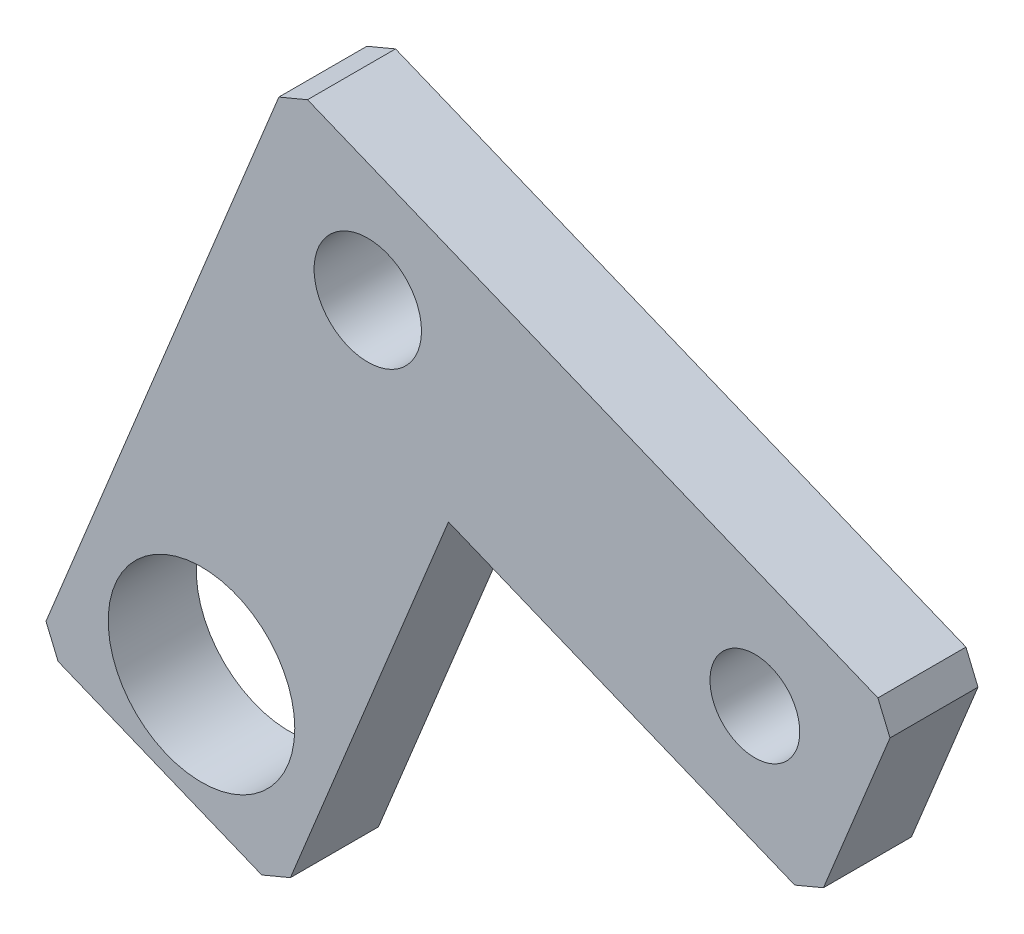
ISO-10303-21;
HEADER;
FILE_DESCRIPTION(('STEP AP214'),'2;1');
FILE_NAME('part.step','',(''),(''),'','','');
FILE_SCHEMA(('AUTOMOTIVE_DESIGN { 1 0 10303 214 1 1 1 1 }'));
ENDSEC;
DATA;
#1=APPLICATION_CONTEXT('core data for automotive mechanical design processes');
#2=APPLICATION_PROTOCOL_DEFINITION('international standard','automotive_design',2000,#1);
#3=PRODUCT_CONTEXT('',#1,'mechanical');
#4=PRODUCT('Part','Part','',(#3));
#5=PRODUCT_RELATED_PRODUCT_CATEGORY('part','',(#4));
#6=PRODUCT_DEFINITION_FORMATION('','',#4);
#7=PRODUCT_DEFINITION_CONTEXT('part definition',#1,'design');
#8=PRODUCT_DEFINITION('design','',#6,#7);
#9=PRODUCT_DEFINITION_SHAPE('','',#8);
#10=(LENGTH_UNIT() NAMED_UNIT(*) SI_UNIT(.MILLI.,.METRE.));
#11=(NAMED_UNIT(*) PLANE_ANGLE_UNIT() SI_UNIT($,.RADIAN.));
#12=(NAMED_UNIT(*) SI_UNIT($,.STERADIAN.) SOLID_ANGLE_UNIT());
#13=UNCERTAINTY_MEASURE_WITH_UNIT(LENGTH_MEASURE(1.E-05),#10,'distance_accuracy_value','');
#14=(GEOMETRIC_REPRESENTATION_CONTEXT(3) GLOBAL_UNCERTAINTY_ASSIGNED_CONTEXT((#13)) GLOBAL_UNIT_ASSIGNED_CONTEXT((#10,
#11,#12)) REPRESENTATION_CONTEXT('',''));
#15=CARTESIAN_POINT('',(0.,0.,0.));
#16=DIRECTION('',(0.,0.,1.));
#17=DIRECTION('',(1.,0.,0.));
#18=AXIS2_PLACEMENT_3D('',#15,#16,#17);
#19=CARTESIAN_POINT('',(-71.0286932422656,-54.4869970943026,-10.));
#20=DIRECTION('',(-0.925838313972113,0.377919854441752,0.));
#21=DIRECTION('',(-0.377919854441752,-0.925838313972113,0.));
#22=AXIS2_PLACEMENT_3D('',#19,#20,#21);
#23=PLANE('',#22);
#24=DIRECTION('',(-0.377919854441752,-0.925838313972113,0.));
#25=VECTOR('',#24,1.);
#26=CARTESIAN_POINT('',(-71.0286932422656,-54.4869970943026,-10.));
#27=LINE('',#26,#25);
#28=CARTESIAN_POINT('',(-43.6295037952386,12.6362806686756,-10.));
#29=VERTEX_POINT('',#28);
#30=CARTESIAN_POINT('',(-70.0838936061613,-52.1724013093723,-10.));
#31=VERTEX_POINT('',#30);
#32=EDGE_CURVE('E162',#29,#31,#27,.T.);
#33=ORIENTED_EDGE('',*,*,#32,.T.);
#34=DIRECTION('',(0.,0.,1.));
#35=VECTOR('',#34,1.);
#36=CARTESIAN_POINT('',(-70.0838936061613,-52.1724013093723,-10.));
#37=LINE('',#36,#35);
#38=CARTESIAN_POINT('',(-70.0838936061613,-52.1724013093723,0.));
#39=VERTEX_POINT('',#38);
#40=EDGE_CURVE('E11',#31,#39,#37,.T.);
#41=ORIENTED_EDGE('',*,*,#40,.T.);
#42=DIRECTION('',(-0.377919854441752,-0.925838313972113,0.));
#43=VECTOR('',#42,1.);
#44=CARTESIAN_POINT('',(-71.0286932422656,-54.4869970943026,0.));
#45=LINE('',#44,#43);
#46=CARTESIAN_POINT('',(-43.6295037952386,12.6362806686756,0.));
#47=VERTEX_POINT('',#46);
#48=EDGE_CURVE('E147',#47,#39,#45,.T.);
#49=ORIENTED_EDGE('',*,*,#48,.F.);
#50=DIRECTION('',(0.,0.,-1.));
#51=VECTOR('',#50,1.);
#52=CARTESIAN_POINT('',(-43.6295037952386,12.6362806686756,-10.));
#53=LINE('',#52,#51);
#54=EDGE_CURVE('E41',#47,#29,#53,.T.);
#55=ORIENTED_EDGE('',*,*,#54,.T.);
#56=EDGE_LOOP('',(#33,#41,#49,#55));
#57=FACE_BOUND('',#56,.T.);
#58=ADVANCED_FACE('F33',(#57),#23,.T.);
#59=CARTESIAN_POINT('',(-42.6847041591342,14.9508764536059,-10.));
#60=DIRECTION('',(0.377919854441753,0.925838313972113,0.));
#61=DIRECTION('',(-0.925838313972113,0.377919854441753,0.));
#62=AXIS2_PLACEMENT_3D('',#59,#60,#61);
#63=PLANE('',#62);
#64=DIRECTION('',(-0.925838313972113,0.377919854441753,0.));
#65=VECTOR('',#64,1.);
#66=CARTESIAN_POINT('',(-42.6847041591342,14.9508764536059,0.));
#67=LINE('',#66,#65);
#68=CARTESIAN_POINT('',(24.438573603844,-12.4483129934212,0.));
#69=VERTEX_POINT('',#68);
#70=CARTESIAN_POINT('',(-40.3701083742039,14.0060768175015,0.));
#71=VERTEX_POINT('',#70);
#72=EDGE_CURVE('E160',#69,#71,#67,.T.);
#73=ORIENTED_EDGE('',*,*,#72,.F.);
#74=DIRECTION('',(0.,0.,-1.));
#75=VECTOR('',#74,1.);
#76=CARTESIAN_POINT('',(24.438573603844,-12.4483129934212,-10.));
#77=LINE('',#76,#75);
#78=CARTESIAN_POINT('',(24.438573603844,-12.4483129934212,-10.));
#79=VERTEX_POINT('',#78);
#80=EDGE_CURVE('E197',#69,#79,#77,.T.);
#81=ORIENTED_EDGE('',*,*,#80,.T.);
#82=DIRECTION('',(-0.925838313972113,0.377919854441753,0.));
#83=VECTOR('',#82,1.);
#84=CARTESIAN_POINT('',(-42.6847041591342,14.9508764536059,-10.));
#85=LINE('',#84,#83);
#86=CARTESIAN_POINT('',(-40.3701083742039,14.0060768175015,-10.));
#87=VERTEX_POINT('',#86);
#88=EDGE_CURVE('E137',#79,#87,#85,.T.);
#89=ORIENTED_EDGE('',*,*,#88,.T.);
#90=DIRECTION('',(0.,0.,1.));
#91=VECTOR('',#90,1.);
#92=CARTESIAN_POINT('',(-40.3701083742039,14.0060768175015,-10.));
#93=LINE('',#92,#91);
#94=EDGE_CURVE('E194',#87,#71,#93,.T.);
#95=ORIENTED_EDGE('',*,*,#94,.T.);
#96=EDGE_LOOP('',(#73,#81,#89,#95));
#97=FACE_BOUND('',#96,.T.);
#98=ADVANCED_FACE('F212',(#97),#63,.T.);
#99=CARTESIAN_POINT('',(26.7531693887742,-13.3931126295256,-10.));
#100=DIRECTION('',(0.925838313972113,-0.377919854441753,0.));
#101=DIRECTION('',(0.377919854441753,0.925838313972113,0.));
#102=AXIS2_PLACEMENT_3D('',#99,#100,#101);
#103=PLANE('',#102);
#104=DIRECTION('',(0.377919854441753,0.925838313972113,0.));
#105=VECTOR('',#104,1.);
#106=CARTESIAN_POINT('',(26.7531693887742,-13.3931126295256,0.));
#107=LINE('',#106,#105);
#108=CARTESIAN_POINT('',(18.2499726638348,-34.2244746938981,0.));
#109=VERTEX_POINT('',#108);
#110=CARTESIAN_POINT('',(25.8083697526699,-15.7077084144558,0.));
#111=VERTEX_POINT('',#110);
#112=EDGE_CURVE('E157',#109,#111,#107,.T.);
#113=ORIENTED_EDGE('',*,*,#112,.F.);
#114=DIRECTION('',(0.,0.,-1.));
#115=VECTOR('',#114,1.);
#116=CARTESIAN_POINT('',(18.2499726638348,-34.2244746938981,-10.));
#117=LINE('',#116,#115);
#118=CARTESIAN_POINT('',(18.2499726638348,-34.2244746938981,-10.));
#119=VERTEX_POINT('',#118);
#120=EDGE_CURVE('E192',#109,#119,#117,.T.);
#121=ORIENTED_EDGE('',*,*,#120,.T.);
#122=DIRECTION('',(0.377919854441753,0.925838313972113,0.));
#123=VECTOR('',#122,1.);
#124=CARTESIAN_POINT('',(26.7531693887742,-13.3931126295256,-10.));
#125=LINE('',#124,#123);
#126=CARTESIAN_POINT('',(25.8083697526699,-15.7077084144558,-10.));
#127=VERTEX_POINT('',#126);
#128=EDGE_CURVE('E140',#119,#127,#125,.T.);
#129=ORIENTED_EDGE('',*,*,#128,.T.);
#130=DIRECTION('',(0.,0.,1.));
#131=VECTOR('',#130,1.);
#132=CARTESIAN_POINT('',(25.8083697526699,-15.7077084144558,-10.));
#133=LINE('',#132,#131);
#134=EDGE_CURVE('E189',#127,#111,#133,.T.);
#135=ORIENTED_EDGE('',*,*,#134,.T.);
#136=EDGE_LOOP('',(#113,#121,#129,#135));
#137=FACE_BOUND('',#136,.T.);
#138=ADVANCED_FACE('F221',(#137),#103,.T.);
#139=CARTESIAN_POINT('',(17.3051730277304,-36.5390704788284,-10.));
#140=DIRECTION('',(-0.377919854441752,-0.925838313972113,0.));
#141=DIRECTION('',(0.925838313972113,-0.377919854441753,0.));
#142=AXIS2_PLACEMENT_3D('',#139,#140,#141);
#143=PLANE('',#142);
#144=DIRECTION('',(0.925838313972113,-0.377919854441752,0.));
#145=VECTOR('',#144,1.);
#146=CARTESIAN_POINT('',(17.3051730277304,-36.5390704788284,-10.));
#147=LINE('',#146,#145);
#148=CARTESIAN_POINT('',(-24.3575511010146,-19.5326770289495,-10.));
#149=VERTEX_POINT('',#148);
#150=CARTESIAN_POINT('',(14.9905772428001,-35.594270842724,-10.));
#151=VERTEX_POINT('',#150);
#152=EDGE_CURVE('E127',#149,#151,#147,.T.);
#153=ORIENTED_EDGE('',*,*,#152,.T.);
#154=DIRECTION('',(0.,0.,1.));
#155=VECTOR('',#154,1.);
#156=CARTESIAN_POINT('',(14.9905772428001,-35.594270842724,-10.));
#157=LINE('',#156,#155);
#158=CARTESIAN_POINT('',(14.9905772428001,-35.594270842724,0.));
#159=VERTEX_POINT('',#158);
#160=EDGE_CURVE('E187',#151,#159,#157,.T.);
#161=ORIENTED_EDGE('',*,*,#160,.T.);
#162=DIRECTION('',(0.925838313972113,-0.377919854441752,0.));
#163=VECTOR('',#162,1.);
#164=CARTESIAN_POINT('',(17.3051730277304,-36.5390704788284,0.));
#165=LINE('',#164,#163);
#166=CARTESIAN_POINT('',(-24.3575511010146,-19.5326770289495,0.));
#167=VERTEX_POINT('',#166);
#168=EDGE_CURVE('E135',#167,#159,#165,.T.);
#169=ORIENTED_EDGE('',*,*,#168,.F.);
#170=DIRECTION('',(0.,0.,1.));
#171=VECTOR('',#170,1.);
#172=CARTESIAN_POINT('',(-24.3575511010146,-19.5326770289495,-10.));
#173=LINE('',#172,#171);
#174=EDGE_CURVE('E122',#149,#167,#173,.T.);
#175=ORIENTED_EDGE('',*,*,#174,.F.);
#176=EDGE_LOOP('',(#153,#161,#169,#175));
#177=FACE_BOUND('',#176,.T.);
#178=ADVANCED_FACE('F131',(#177),#143,.T.);
#179=CARTESIAN_POINT('',(-24.3575511010146,-19.5326770289495,-10.));
#180=DIRECTION('',(0.925838313972113,-0.377919854441753,0.));
#181=DIRECTION('',(0.377919854441753,0.925838313972113,0.));
#182=AXIS2_PLACEMENT_3D('',#179,#180,#181);
#183=PLANE('',#182);
#184=DIRECTION('',(0.377919854441753,0.925838313972113,0.));
#185=VECTOR('',#184,1.);
#186=CARTESIAN_POINT('',(-24.3575511010146,-19.5326770289495,0.));
#187=LINE('',#186,#185);
#188=CARTESIAN_POINT('',(-42.3087441869979,-63.5099969426249,0.));
#189=VERTEX_POINT('',#188);
#190=EDGE_CURVE('E154',#189,#167,#187,.T.);
#191=ORIENTED_EDGE('',*,*,#190,.F.);
#192=DIRECTION('',(0.,0.,-1.));
#193=VECTOR('',#192,1.);
#194=CARTESIAN_POINT('',(-42.3087441869979,-63.5099969426249,-10.));
#195=LINE('',#194,#193);
#196=CARTESIAN_POINT('',(-42.3087441869979,-63.5099969426249,-10.));
#197=VERTEX_POINT('',#196);
#198=EDGE_CURVE('E125',#189,#197,#195,.T.);
#199=ORIENTED_EDGE('',*,*,#198,.T.);
#200=DIRECTION('',(0.377919854441753,0.925838313972113,0.));
#201=VECTOR('',#200,1.);
#202=CARTESIAN_POINT('',(-24.3575511010146,-19.5326770289495,-10.));
#203=LINE('',#202,#201);
#204=EDGE_CURVE('E118',#197,#149,#203,.T.);
#205=ORIENTED_EDGE('',*,*,#204,.T.);
#206=ORIENTED_EDGE('',*,*,#174,.T.);
#207=EDGE_LOOP('',(#191,#199,#205,#206));
#208=FACE_BOUND('',#207,.T.);
#209=ADVANCED_FACE('F121',(#208),#183,.T.);
#210=CARTESIAN_POINT('',(-43.2535438231023,-65.8245927275552,-10.));
#211=DIRECTION('',(-0.377919854441753,-0.925838313972113,0.));
#212=DIRECTION('',(0.925838313972113,-0.377919854441753,0.));
#213=AXIS2_PLACEMENT_3D('',#210,#211,#212);
#214=PLANE('',#213);
#215=DIRECTION('',(0.925838313972113,-0.377919854441753,0.));
#216=VECTOR('',#215,1.);
#217=CARTESIAN_POINT('',(-43.2535438231023,-65.8245927275552,-10.));
#218=LINE('',#217,#216);
#219=CARTESIAN_POINT('',(-68.7140974573353,-55.431796730407,-10.));
#220=VERTEX_POINT('',#219);
#221=CARTESIAN_POINT('',(-45.5681396080326,-64.8797930914508,-10.));
#222=VERTEX_POINT('',#221);
#223=EDGE_CURVE('E128',#220,#222,#218,.T.);
#224=ORIENTED_EDGE('',*,*,#223,.T.);
#225=DIRECTION('',(0.,0.,1.));
#226=VECTOR('',#225,1.);
#227=CARTESIAN_POINT('',(-45.5681396080326,-64.8797930914508,-10.));
#228=LINE('',#227,#226);
#229=CARTESIAN_POINT('',(-45.5681396080326,-64.8797930914508,0.));
#230=VERTEX_POINT('',#229);
#231=EDGE_CURVE('E165',#222,#230,#228,.T.);
#232=ORIENTED_EDGE('',*,*,#231,.T.);
#233=DIRECTION('',(0.925838313972113,-0.377919854441753,0.));
#234=VECTOR('',#233,1.);
#235=CARTESIAN_POINT('',(-43.2535438231023,-65.8245927275552,0.));
#236=LINE('',#235,#234);
#237=CARTESIAN_POINT('',(-68.7140974573353,-55.431796730407,0.));
#238=VERTEX_POINT('',#237);
#239=EDGE_CURVE('E150',#238,#230,#236,.T.);
#240=ORIENTED_EDGE('',*,*,#239,.F.);
#241=DIRECTION('',(0.,0.,-1.));
#242=VECTOR('',#241,1.);
#243=CARTESIAN_POINT('',(-68.7140974573353,-55.431796730407,-10.));
#244=LINE('',#243,#242);
#245=EDGE_CURVE('E136',#238,#220,#244,.T.);
#246=ORIENTED_EDGE('',*,*,#245,.T.);
#247=EDGE_LOOP('',(#224,#232,#240,#246));
#248=FACE_BOUND('',#247,.T.);
#249=ADVANCED_FACE('F230',(#248),#214,.T.);
#250=CARTESIAN_POINT('',(0.,0.,-10.));
#251=DIRECTION('',(0.,0.,-1.));
#252=DIRECTION('',(-1.,0.,0.));
#253=AXIS2_PLACEMENT_3D('',#250,#251,#252);
#254=PLANE('',#253);
#255=CARTESIAN_POINT('',(-52.417120352162,-48.5828159862775,-10.));
#256=DIRECTION('',(0.,0.,1.));
#257=DIRECTION('',(1.,0.,0.));
#258=AXIS2_PLACEMENT_3D('',#255,#256,#257);
#259=CIRCLE('',#258,10.6);
#260=CARTESIAN_POINT('',(-41.817120352162,-48.5828159862775,-10.));
#261=VERTEX_POINT('',#260);
#262=EDGE_CURVE('E243',#261,#261,#259,.T.);
#263=ORIENTED_EDGE('',*,*,#262,.T.);
#264=EDGE_LOOP('',(#263));
#265=FACE_BOUND('',#264,.T.);
#266=CARTESIAN_POINT('',(-33.5211276300744,-2.29090028767186,-10.));
#267=DIRECTION('',(0.,0.,1.));
#268=DIRECTION('',(1.,0.,0.));
#269=AXIS2_PLACEMENT_3D('',#266,#267,#268);
#270=CIRCLE('',#269,6.1);
#271=CARTESIAN_POINT('',(-27.4211276300744,-2.29090028767186,-10.));
#272=VERTEX_POINT('',#271);
#273=EDGE_CURVE('E237',#272,#272,#270,.T.);
#274=ORIENTED_EDGE('',*,*,#273,.T.);
#275=EDGE_LOOP('',(#274));
#276=FACE_BOUND('',#275,.T.);
#277=CARTESIAN_POINT('',(10.4561922836009,-20.2420933736551,-10.));
#278=DIRECTION('',(0.,0.,1.));
#279=DIRECTION('',(1.,0.,0.));
#280=AXIS2_PLACEMENT_3D('',#277,#278,#279);
#281=CIRCLE('',#280,5.1);
#282=CARTESIAN_POINT('',(15.5561922836009,-20.2420933736551,-10.));
#283=VERTEX_POINT('',#282);
#284=EDGE_CURVE('E151',#283,#283,#281,.T.);
#285=ORIENTED_EDGE('',*,*,#284,.T.);
#286=EDGE_LOOP('',(#285));
#287=FACE_BOUND('',#286,.T.);
#288=ORIENTED_EDGE('',*,*,#204,.F.);
#289=DIRECTION('',(0.921896241912798,0.387436858271203,0.));
#290=VECTOR('',#289,1.);
#291=CARTESIAN_POINT('',(16.3334315672133,-38.8649888566191,-10.));
#292=LINE('',#291,#290);
#293=EDGE_CURVE('E185',#197,#222,#292,.F.);
#294=ORIENTED_EDGE('',*,*,#293,.T.);
#295=ORIENTED_EDGE('',*,*,#223,.F.);
#296=DIRECTION('',(0.387436858271208,-0.921896241912796,0.));
#297=VECTOR('',#296,1.);
#298=CARTESIAN_POINT('',(-78.1985482804191,-32.8637849789617,-10.));
#299=LINE('',#298,#297);
#300=EDGE_CURVE('E181',#220,#31,#299,.F.);
#301=ORIENTED_EDGE('',*,*,#300,.T.);
#302=ORIENTED_EDGE('',*,*,#32,.F.);
#303=DIRECTION('',(-0.921896241912797,-0.387436858271204,0.));
#304=VECTOR('',#303,1.);
#305=CARTESIAN_POINT('',(-11.0624914093047,26.3229195640744,-10.));
#306=LINE('',#305,#304);
#307=EDGE_CURVE('E179',#29,#87,#306,.F.);
#308=ORIENTED_EDGE('',*,*,#307,.T.);
#309=ORIENTED_EDGE('',*,*,#88,.F.);
#310=DIRECTION('',(-0.387436858271207,0.921896241912796,0.));
#311=VECTOR('',#310,1.);
#312=CARTESIAN_POINT('',(16.323918929586,6.86030333698977,-10.));
#313=LINE('',#312,#311);
#314=EDGE_CURVE('E54',#79,#127,#313,.F.);
#315=ORIENTED_EDGE('',*,*,#314,.T.);
#316=ORIENTED_EDGE('',*,*,#128,.F.);
#317=DIRECTION('',(0.921896241912796,0.387436858271207,0.));
#318=VECTOR('',#317,1.);
#319=CARTESIAN_POINT('',(14.9636354183875,-35.6055934355842,-10.));
#320=LINE('',#319,#318);
#321=EDGE_CURVE('E48',#119,#151,#320,.F.);
#322=ORIENTED_EDGE('',*,*,#321,.T.);
#323=ORIENTED_EDGE('',*,*,#152,.F.);
#324=EDGE_LOOP('',(#288,#294,#295,#301,#302,#308,#309,#315,#316,#322,#323));
#325=FACE_BOUND('',#324,.T.);
#326=ADVANCED_FACE('F139',(#265,#276,#287,#325),#254,.T.);
#327=CARTESIAN_POINT('',(0.,0.,0.));
#328=DIRECTION('',(0.,0.,-1.));
#329=DIRECTION('',(-1.,0.,0.));
#330=AXIS2_PLACEMENT_3D('',#327,#328,#329);
#331=PLANE('',#330);
#332=CARTESIAN_POINT('',(-52.417120352162,-48.5828159862775,0.));
#333=DIRECTION('',(0.,0.,1.));
#334=DIRECTION('',(1.,0.,0.));
#335=AXIS2_PLACEMENT_3D('',#332,#333,#334);
#336=CIRCLE('',#335,10.6);
#337=CARTESIAN_POINT('',(-41.817120352162,-48.5828159862775,0.));
#338=VERTEX_POINT('',#337);
#339=EDGE_CURVE('E246',#338,#338,#336,.T.);
#340=ORIENTED_EDGE('',*,*,#339,.F.);
#341=EDGE_LOOP('',(#340));
#342=FACE_BOUND('',#341,.T.);
#343=CARTESIAN_POINT('',(-33.5211276300744,-2.29090028767186,0.));
#344=DIRECTION('',(0.,0.,1.));
#345=DIRECTION('',(1.,0.,0.));
#346=AXIS2_PLACEMENT_3D('',#343,#344,#345);
#347=CIRCLE('',#346,6.1);
#348=CARTESIAN_POINT('',(-27.4211276300744,-2.29090028767186,0.));
#349=VERTEX_POINT('',#348);
#350=EDGE_CURVE('E240',#349,#349,#347,.T.);
#351=ORIENTED_EDGE('',*,*,#350,.F.);
#352=EDGE_LOOP('',(#351));
#353=FACE_BOUND('',#352,.T.);
#354=CARTESIAN_POINT('',(10.4561922836009,-20.2420933736551,0.));
#355=DIRECTION('',(0.,0.,1.));
#356=DIRECTION('',(1.,0.,0.));
#357=AXIS2_PLACEMENT_3D('',#354,#355,#356);
#358=CIRCLE('',#357,5.1);
#359=CARTESIAN_POINT('',(15.5561922836009,-20.2420933736551,0.));
#360=VERTEX_POINT('',#359);
#361=EDGE_CURVE('E234',#360,#360,#358,.T.);
#362=ORIENTED_EDGE('',*,*,#361,.F.);
#363=EDGE_LOOP('',(#362));
#364=FACE_BOUND('',#363,.T.);
#365=ORIENTED_EDGE('',*,*,#239,.T.);
#366=DIRECTION('',(-0.921896241912798,-0.387436858271203,0.));
#367=VECTOR('',#366,1.);
#368=CARTESIAN_POINT('',(-45.5681396080326,-64.8797930914508,0.));
#369=LINE('',#368,#367);
#370=EDGE_CURVE('E176',#230,#189,#369,.F.);
#371=ORIENTED_EDGE('',*,*,#370,.T.);
#372=ORIENTED_EDGE('',*,*,#190,.T.);
#373=ORIENTED_EDGE('',*,*,#168,.T.);
#374=DIRECTION('',(-0.921896241912796,-0.387436858271207,0.));
#375=VECTOR('',#374,1.);
#376=CARTESIAN_POINT('',(14.9905772428001,-35.594270842724,0.));
#377=LINE('',#376,#375);
#378=EDGE_CURVE('E174',#159,#109,#377,.F.);
#379=ORIENTED_EDGE('',*,*,#378,.T.);
#380=ORIENTED_EDGE('',*,*,#112,.T.);
#381=DIRECTION('',(0.387436858271207,-0.921896241912796,0.));
#382=VECTOR('',#381,1.);
#383=CARTESIAN_POINT('',(25.8083697526699,-15.7077084144558,0.));
#384=LINE('',#383,#382);
#385=EDGE_CURVE('E172',#111,#69,#384,.F.);
#386=ORIENTED_EDGE('',*,*,#385,.T.);
#387=ORIENTED_EDGE('',*,*,#72,.T.);
#388=DIRECTION('',(0.921896241912797,0.387436858271204,0.));
#389=VECTOR('',#388,1.);
#390=CARTESIAN_POINT('',(-40.3701083742039,14.0060768175015,0.));
#391=LINE('',#390,#389);
#392=EDGE_CURVE('E168',#71,#47,#391,.F.);
#393=ORIENTED_EDGE('',*,*,#392,.T.);
#394=ORIENTED_EDGE('',*,*,#48,.T.);
#395=DIRECTION('',(-0.387436858271208,0.921896241912796,0.));
#396=VECTOR('',#395,1.);
#397=CARTESIAN_POINT('',(-70.0838936061613,-52.1724013093723,0.));
#398=LINE('',#397,#396);
#399=EDGE_CURVE('E170',#39,#238,#398,.F.);
#400=ORIENTED_EDGE('',*,*,#399,.T.);
#401=EDGE_LOOP('',(#365,#371,#372,#373,#379,#380,#386,#387,#393,#394,#400));
#402=FACE_BOUND('',#401,.T.);
#403=ADVANCED_FACE('F215',(#342,#353,#364,#402),#331,.F.);
#404=CARTESIAN_POINT('',(10.4561922836009,-20.2420933736551,-10.));
#405=DIRECTION('',(0.,0.,1.));
#406=DIRECTION('',(1.,0.,0.));
#407=AXIS2_PLACEMENT_3D('',#404,#405,#406);
#408=CYLINDRICAL_SURFACE('',#407,5.1);
#409=ORIENTED_EDGE('',*,*,#284,.F.);
#410=EDGE_LOOP('',(#409));
#411=FACE_BOUND('',#410,.T.);
#412=ORIENTED_EDGE('',*,*,#361,.T.);
#413=EDGE_LOOP('',(#412));
#414=FACE_BOUND('',#413,.T.);
#415=ADVANCED_FACE('F263',(#411,#414),#408,.F.);
#416=CARTESIAN_POINT('',(-33.5211276300744,-2.29090028767186,-10.));
#417=DIRECTION('',(0.,0.,1.));
#418=DIRECTION('',(1.,0.,0.));
#419=AXIS2_PLACEMENT_3D('',#416,#417,#418);
#420=CYLINDRICAL_SURFACE('',#419,6.1);
#421=ORIENTED_EDGE('',*,*,#273,.F.);
#422=EDGE_LOOP('',(#421));
#423=FACE_BOUND('',#422,.T.);
#424=ORIENTED_EDGE('',*,*,#350,.T.);
#425=EDGE_LOOP('',(#424));
#426=FACE_BOUND('',#425,.T.);
#427=ADVANCED_FACE('F257',(#423,#426),#420,.F.);
#428=CARTESIAN_POINT('',(-52.417120352162,-48.5828159862775,-10.));
#429=DIRECTION('',(0.,0.,1.));
#430=DIRECTION('',(1.,0.,0.));
#431=AXIS2_PLACEMENT_3D('',#428,#429,#430);
#432=CYLINDRICAL_SURFACE('',#431,10.6);
#433=ORIENTED_EDGE('',*,*,#262,.F.);
#434=EDGE_LOOP('',(#433));
#435=FACE_BOUND('',#434,.T.);
#436=ORIENTED_EDGE('',*,*,#339,.T.);
#437=EDGE_LOOP('',(#436));
#438=FACE_BOUND('',#437,.T.);
#439=ADVANCED_FACE('F254',(#435,#438),#432,.F.);
#440=CARTESIAN_POINT('',(-45.5681396080326,-64.8797930914508,-10.));
#441=DIRECTION('',(-0.387436858271203,0.921896241912798,0.));
#442=DIRECTION('',(0.,0.,1.));
#443=AXIS2_PLACEMENT_3D('',#440,#441,#442);
#444=PLANE('',#443);
#445=ORIENTED_EDGE('',*,*,#293,.F.);
#446=ORIENTED_EDGE('',*,*,#198,.F.);
#447=ORIENTED_EDGE('',*,*,#370,.F.);
#448=ORIENTED_EDGE('',*,*,#231,.F.);
#449=EDGE_LOOP('',(#445,#446,#447,#448));
#450=FACE_BOUND('',#449,.T.);
#451=ADVANCED_FACE('F226',(#450),#444,.F.);
#452=CARTESIAN_POINT('',(14.9905772428001,-35.594270842724,-10.));
#453=DIRECTION('',(-0.387436858271207,0.921896241912796,0.));
#454=DIRECTION('',(0.,0.,1.));
#455=AXIS2_PLACEMENT_3D('',#452,#453,#454);
#456=PLANE('',#455);
#457=ORIENTED_EDGE('',*,*,#321,.F.);
#458=ORIENTED_EDGE('',*,*,#120,.F.);
#459=ORIENTED_EDGE('',*,*,#378,.F.);
#460=ORIENTED_EDGE('',*,*,#160,.F.);
#461=EDGE_LOOP('',(#457,#458,#459,#460));
#462=FACE_BOUND('',#461,.T.);
#463=ADVANCED_FACE('F224',(#462),#456,.F.);
#464=CARTESIAN_POINT('',(25.8083697526699,-15.7077084144558,-10.));
#465=DIRECTION('',(-0.921896241912796,-0.387436858271207,0.));
#466=DIRECTION('',(0.,0.,1.));
#467=AXIS2_PLACEMENT_3D('',#464,#465,#466);
#468=PLANE('',#467);
#469=ORIENTED_EDGE('',*,*,#314,.F.);
#470=ORIENTED_EDGE('',*,*,#80,.F.);
#471=ORIENTED_EDGE('',*,*,#385,.F.);
#472=ORIENTED_EDGE('',*,*,#134,.F.);
#473=EDGE_LOOP('',(#469,#470,#471,#472));
#474=FACE_BOUND('',#473,.T.);
#475=ADVANCED_FACE('F219',(#474),#468,.F.);
#476=CARTESIAN_POINT('',(-70.0838936061613,-52.1724013093723,-10.));
#477=DIRECTION('',(0.921896241912796,0.387436858271208,0.));
#478=DIRECTION('',(0.,0.,1.));
#479=AXIS2_PLACEMENT_3D('',#476,#477,#478);
#480=PLANE('',#479);
#481=ORIENTED_EDGE('',*,*,#300,.F.);
#482=ORIENTED_EDGE('',*,*,#245,.F.);
#483=ORIENTED_EDGE('',*,*,#399,.F.);
#484=ORIENTED_EDGE('',*,*,#40,.F.);
#485=EDGE_LOOP('',(#481,#482,#483,#484));
#486=FACE_BOUND('',#485,.T.);
#487=ADVANCED_FACE('F293',(#486),#480,.F.);
#488=CARTESIAN_POINT('',(-40.3701083742039,14.0060768175015,-10.));
#489=DIRECTION('',(0.387436858271204,-0.921896241912797,0.));
#490=DIRECTION('',(0.,0.,1.));
#491=AXIS2_PLACEMENT_3D('',#488,#489,#490);
#492=PLANE('',#491);
#493=ORIENTED_EDGE('',*,*,#307,.F.);
#494=ORIENTED_EDGE('',*,*,#54,.F.);
#495=ORIENTED_EDGE('',*,*,#392,.F.);
#496=ORIENTED_EDGE('',*,*,#94,.F.);
#497=EDGE_LOOP('',(#493,#494,#495,#496));
#498=FACE_BOUND('',#497,.T.);
#499=ADVANCED_FACE('F35',(#498),#492,.F.);
#500=CLOSED_SHELL('',(#58,#98,#138,#178,#209,#249,#326,#403,#415,#427,#439,#451,#463,#475,#487,#499));
#501=MANIFOLD_SOLID_BREP('B2',#500);
#502=ADVANCED_BREP_SHAPE_REPRESENTATION('',(#18,#501),#14);
#503=SHAPE_DEFINITION_REPRESENTATION(#9,#502);
ENDSEC;
END-ISO-10303-21;
